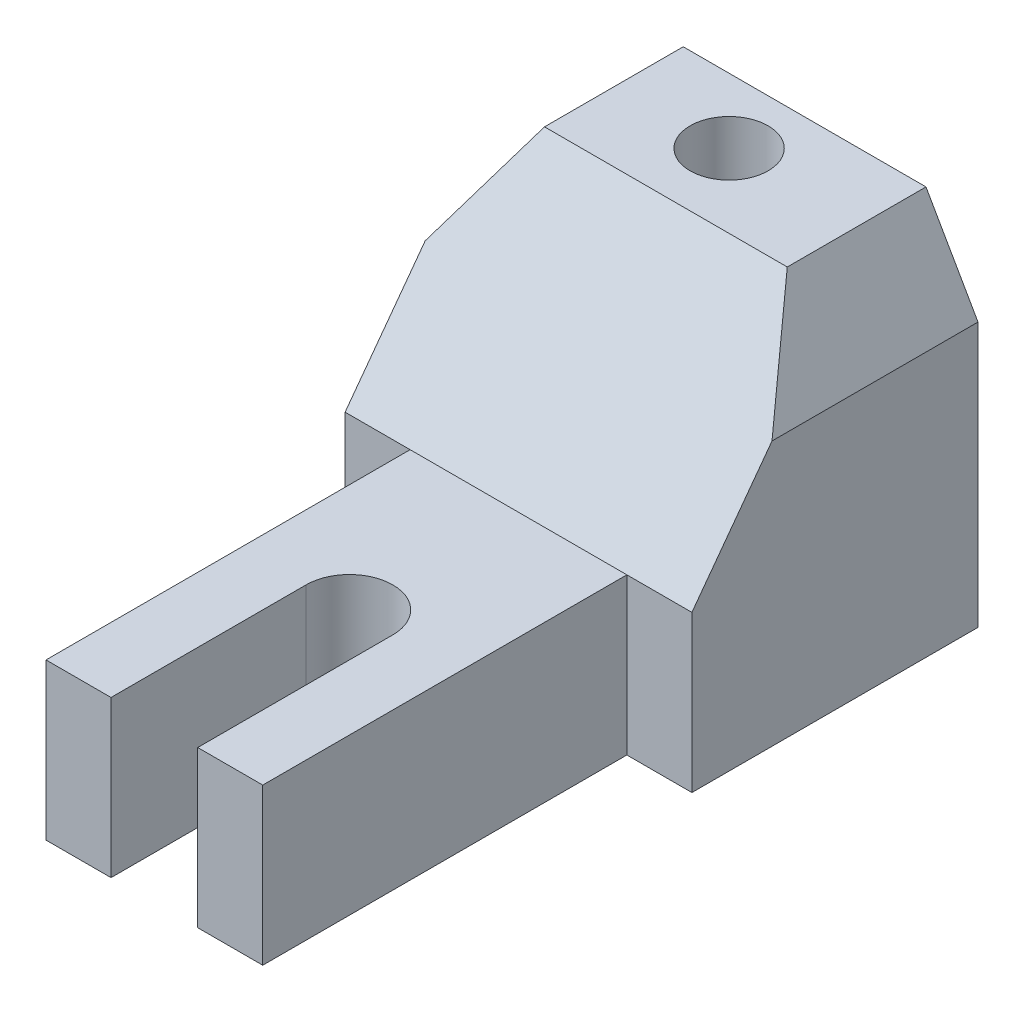
ISO-10303-21;
HEADER;
FILE_DESCRIPTION(('STEP AP214'),'2;1');
FILE_NAME('part.step','',(''),(''),'','','');
FILE_SCHEMA(('AUTOMOTIVE_DESIGN { 1 0 10303 214 1 1 1 1 }'));
ENDSEC;
DATA;
#1=APPLICATION_CONTEXT('core data for automotive mechanical design processes');
#2=APPLICATION_PROTOCOL_DEFINITION('international standard','automotive_design',2000,#1);
#3=PRODUCT_CONTEXT('',#1,'mechanical');
#4=PRODUCT('Part','Part','',(#3));
#5=PRODUCT_RELATED_PRODUCT_CATEGORY('part','',(#4));
#6=PRODUCT_DEFINITION_FORMATION('','',#4);
#7=PRODUCT_DEFINITION_CONTEXT('part definition',#1,'design');
#8=PRODUCT_DEFINITION('design','',#6,#7);
#9=PRODUCT_DEFINITION_SHAPE('','',#8);
#10=(LENGTH_UNIT() NAMED_UNIT(*) SI_UNIT(.MILLI.,.METRE.));
#11=(NAMED_UNIT(*) PLANE_ANGLE_UNIT() SI_UNIT($,.RADIAN.));
#12=(NAMED_UNIT(*) SI_UNIT($,.STERADIAN.) SOLID_ANGLE_UNIT());
#13=UNCERTAINTY_MEASURE_WITH_UNIT(LENGTH_MEASURE(1.E-05),#10,'distance_accuracy_value','');
#14=(GEOMETRIC_REPRESENTATION_CONTEXT(3) GLOBAL_UNCERTAINTY_ASSIGNED_CONTEXT((#13)) GLOBAL_UNIT_ASSIGNED_CONTEXT((#10,
#11,#12)) REPRESENTATION_CONTEXT('',''));
#15=CARTESIAN_POINT('',(0.,0.,0.));
#16=DIRECTION('',(0.,0.,1.));
#17=DIRECTION('',(1.,0.,0.));
#18=AXIS2_PLACEMENT_3D('',#15,#16,#17);
#19=CARTESIAN_POINT('',(-80.,0.,44.1718749999995));
#20=DIRECTION('',(0.,0.,1.));
#21=DIRECTION('',(1.,0.,0.));
#22=AXIS2_PLACEMENT_3D('',#19,#20,#21);
#23=PLANE('',#22);
#24=DIRECTION('',(1.,0.,0.));
#25=VECTOR('',#24,1.);
#26=CARTESIAN_POINT('',(-80.,36.,44.1718749999995));
#27=LINE('',#26,#25);
#28=CARTESIAN_POINT('',(-15.,36.,44.1718749999995));
#29=VERTEX_POINT('',#28);
#30=CARTESIAN_POINT('',(0.,36.,44.1718749999995));
#31=VERTEX_POINT('',#30);
#32=EDGE_CURVE('E257',#29,#31,#27,.T.);
#33=ORIENTED_EDGE('',*,*,#32,.F.);
#34=DIRECTION('',(0.,-1.,0.));
#35=VECTOR('',#34,1.);
#36=CARTESIAN_POINT('',(-15.,36.,44.1718749999995));
#37=LINE('',#36,#35);
#38=CARTESIAN_POINT('',(-15.,0.,44.1718749999995));
#39=VERTEX_POINT('',#38);
#40=EDGE_CURVE('E213',#29,#39,#37,.T.);
#41=ORIENTED_EDGE('',*,*,#40,.T.);
#42=DIRECTION('',(1.,0.,0.));
#43=VECTOR('',#42,1.);
#44=CARTESIAN_POINT('',(-80.,0.,44.1718749999995));
#45=LINE('',#44,#43);
#46=CARTESIAN_POINT('',(0.,0.,44.1718749999995));
#47=VERTEX_POINT('',#46);
#48=EDGE_CURVE('E253',#39,#47,#45,.T.);
#49=ORIENTED_EDGE('',*,*,#48,.T.);
#50=DIRECTION('',(0.,-1.,0.));
#51=VECTOR('',#50,1.);
#52=CARTESIAN_POINT('',(0.,0.,44.1718749999995));
#53=LINE('',#52,#51);
#54=EDGE_CURVE('E231',#31,#47,#53,.T.);
#55=ORIENTED_EDGE('',*,*,#54,.F.);
#56=EDGE_LOOP('',(#33,#41,#49,#55));
#57=FACE_BOUND('',#56,.T.);
#58=ADVANCED_FACE('F49',(#57),#23,.T.);
#59=CARTESIAN_POINT('',(-80.,0.,-21.8281250000005));
#60=DIRECTION('',(0.,-1.,0.));
#61=DIRECTION('',(0.,0.,-1.));
#62=AXIS2_PLACEMENT_3D('',#59,#60,#61);
#63=PLANE('',#62);
#64=DIRECTION('',(0.,0.,-1.));
#65=VECTOR('',#64,1.);
#66=CARTESIAN_POINT('',(0.,0.,-21.8281250000005));
#67=LINE('',#66,#65);
#68=CARTESIAN_POINT('',(0.,0.,-21.8281250000005));
#69=VERTEX_POINT('',#68);
#70=EDGE_CURVE('E224',#47,#69,#67,.T.);
#71=ORIENTED_EDGE('',*,*,#70,.F.);
#72=ORIENTED_EDGE('',*,*,#48,.F.);
#73=DIRECTION('',(0.,0.,1.));
#74=VECTOR('',#73,1.);
#75=CARTESIAN_POINT('',(-15.,0.,0.));
#76=LINE('',#75,#74);
#77=CARTESIAN_POINT('',(-15.,0.,128.171875));
#78=VERTEX_POINT('',#77);
#79=EDGE_CURVE('E65',#39,#78,#76,.T.);
#80=ORIENTED_EDGE('',*,*,#79,.T.);
#81=DIRECTION('',(1.,0.,0.));
#82=VECTOR('',#81,1.);
#83=CARTESIAN_POINT('',(0.,0.,128.171875));
#84=LINE('',#83,#82);
#85=CARTESIAN_POINT('',(-30.,0.,128.171875));
#86=VERTEX_POINT('',#85);
#87=EDGE_CURVE('E186',#86,#78,#84,.T.);
#88=ORIENTED_EDGE('',*,*,#87,.F.);
#89=DIRECTION('',(0.,0.,-1.));
#90=VECTOR('',#89,1.);
#91=CARTESIAN_POINT('',(-30.,0.,0.));
#92=LINE('',#91,#90);
#93=CARTESIAN_POINT('',(-30.,0.,83.1718749999995));
#94=VERTEX_POINT('',#93);
#95=EDGE_CURVE('E183',#86,#94,#92,.T.);
#96=ORIENTED_EDGE('',*,*,#95,.T.);
#97=CARTESIAN_POINT('',(-40.,0.,83.1718749999995));
#98=DIRECTION('',(0.,-1.,0.));
#99=DIRECTION('',(0.,0.,-1.));
#100=AXIS2_PLACEMENT_3D('',#97,#98,#99);
#101=CIRCLE('',#100,9.99999999999999);
#102=CARTESIAN_POINT('',(-50.,0.,83.1718749999995));
#103=VERTEX_POINT('',#102);
#104=EDGE_CURVE('E199',#103,#94,#101,.T.);
#105=ORIENTED_EDGE('',*,*,#104,.F.);
#106=DIRECTION('',(0.,0.,-1.));
#107=VECTOR('',#106,1.);
#108=CARTESIAN_POINT('',(-50.,0.,0.));
#109=LINE('',#108,#107);
#110=CARTESIAN_POINT('',(-50.,0.,128.171875));
#111=VERTEX_POINT('',#110);
#112=EDGE_CURVE('E173',#111,#103,#109,.T.);
#113=ORIENTED_EDGE('',*,*,#112,.F.);
#114=CARTESIAN_POINT('',(-65.,0.,128.171875));
#115=VERTEX_POINT('',#114);
#116=EDGE_CURVE('E202',#115,#111,#84,.T.);
#117=ORIENTED_EDGE('',*,*,#116,.F.);
#118=DIRECTION('',(0.,0.,1.));
#119=VECTOR('',#118,1.);
#120=CARTESIAN_POINT('',(-65.,0.,0.));
#121=LINE('',#120,#119);
#122=CARTESIAN_POINT('',(-65.,0.,44.1718749999995));
#123=VERTEX_POINT('',#122);
#124=EDGE_CURVE('E204',#123,#115,#121,.T.);
#125=ORIENTED_EDGE('',*,*,#124,.F.);
#126=CARTESIAN_POINT('',(-80.,0.,44.1718749999995));
#127=VERTEX_POINT('',#126);
#128=EDGE_CURVE('E249',#127,#123,#45,.T.);
#129=ORIENTED_EDGE('',*,*,#128,.F.);
#130=DIRECTION('',(0.,0.,-1.));
#131=VECTOR('',#130,1.);
#132=CARTESIAN_POINT('',(-80.,0.,-21.8281250000005));
#133=LINE('',#132,#131);
#134=CARTESIAN_POINT('',(-80.,0.,-21.8281250000005));
#135=VERTEX_POINT('',#134);
#136=EDGE_CURVE('E227',#127,#135,#133,.T.);
#137=ORIENTED_EDGE('',*,*,#136,.T.);
#138=DIRECTION('',(1.,0.,0.));
#139=VECTOR('',#138,1.);
#140=CARTESIAN_POINT('',(-80.,0.,-21.8281250000005));
#141=LINE('',#140,#139);
#142=EDGE_CURVE('E238',#135,#69,#141,.T.);
#143=ORIENTED_EDGE('',*,*,#142,.T.);
#144=EDGE_LOOP('',(#71,#72,#80,#88,#96,#105,#113,#117,#125,#129,#137,#143));
#145=FACE_BOUND('',#144,.T.);
#146=ADVANCED_FACE('F305',(#145),#63,.T.);
#147=DIRECTION('',(0.,-1.,0.));
#148=VECTOR('',#147,1.);
#149=CARTESIAN_POINT('',(-65.,36.,44.1718749999995));
#150=LINE('',#149,#148);
#151=CARTESIAN_POINT('',(-65.,36.,44.1718749999995));
#152=VERTEX_POINT('',#151);
#153=EDGE_CURVE('E215',#152,#123,#150,.T.);
#154=ORIENTED_EDGE('',*,*,#153,.F.);
#155=CARTESIAN_POINT('',(-80.,36.,44.1718749999995));
#156=VERTEX_POINT('',#155);
#157=EDGE_CURVE('E254',#156,#152,#27,.T.);
#158=ORIENTED_EDGE('',*,*,#157,.F.);
#159=DIRECTION('',(0.,-1.,0.));
#160=VECTOR('',#159,1.);
#161=CARTESIAN_POINT('',(-80.,0.,44.1718749999995));
#162=LINE('',#161,#160);
#163=EDGE_CURVE('E235',#156,#127,#162,.T.);
#164=ORIENTED_EDGE('',*,*,#163,.T.);
#165=ORIENTED_EDGE('',*,*,#128,.T.);
#166=EDGE_LOOP('',(#154,#158,#164,#165));
#167=FACE_BOUND('',#166,.T.);
#168=ADVANCED_FACE('F308',(#167),#23,.T.);
#169=CARTESIAN_POINT('',(-80.,36.,44.1718749999995));
#170=DIRECTION('',(0.,0.594391061083806,0.804176141466326));
#171=DIRECTION('',(0.,-0.804176141466326,0.594391061083806));
#172=AXIS2_PLACEMENT_3D('',#169,#170,#171);
#173=PLANE('',#172);
#174=DIRECTION('',(1.,0.,0.));
#175=VECTOR('',#174,1.);
#176=CARTESIAN_POINT('',(-80.,82.,10.1718749999996));
#177=LINE('',#176,#175);
#178=CARTESIAN_POINT('',(-68.,82.,10.1718749999996));
#179=VERTEX_POINT('',#178);
#180=CARTESIAN_POINT('',(-12.,82.,10.1718749999996));
#181=VERTEX_POINT('',#180);
#182=EDGE_CURVE('E258',#179,#181,#177,.T.);
#183=ORIENTED_EDGE('',*,*,#182,.F.);
#184=DIRECTION('',(0.417552512787548,0.730716897378209,-0.540095098062154));
#185=VECTOR('',#184,1.);
#186=CARTESIAN_POINT('',(-91.7949985580686,40.3587525233799,40.950188352284));
#187=LINE('',#186,#185);
#188=CARTESIAN_POINT('',(-80.,61.,25.6936141304343));
#189=VERTEX_POINT('',#188);
#190=EDGE_CURVE('E276',#179,#189,#187,.F.);
#191=ORIENTED_EDGE('',*,*,#190,.T.);
#192=DIRECTION('',(0.,-0.804176141466326,0.594391061083805));
#193=VECTOR('',#192,1.);
#194=CARTESIAN_POINT('',(-80.,36.,44.1718749999995));
#195=LINE('',#194,#193);
#196=EDGE_CURVE('E233',#189,#156,#195,.T.);
#197=ORIENTED_EDGE('',*,*,#196,.T.);
#198=ORIENTED_EDGE('',*,*,#157,.T.);
#199=DIRECTION('',(-1.,0.,0.));
#200=VECTOR('',#199,1.);
#201=CARTESIAN_POINT('',(0.,36.,44.1718749999995));
#202=LINE('',#201,#200);
#203=EDGE_CURVE('E193',#29,#152,#202,.T.);
#204=ORIENTED_EDGE('',*,*,#203,.F.);
#205=ORIENTED_EDGE('',*,*,#32,.T.);
#206=DIRECTION('',(0.,-0.804176141466326,0.594391061083805));
#207=VECTOR('',#206,1.);
#208=CARTESIAN_POINT('',(0.,36.,44.1718749999995));
#209=LINE('',#208,#207);
#210=CARTESIAN_POINT('',(0.,61.,25.6936141304343));
#211=VERTEX_POINT('',#210);
#212=EDGE_CURVE('E244',#211,#31,#209,.T.);
#213=ORIENTED_EDGE('',*,*,#212,.F.);
#214=DIRECTION('',(-0.417552512787548,0.730716897378209,-0.540095098062154));
#215=VECTOR('',#214,1.);
#216=CARTESIAN_POINT('',(-2.15300951674699,64.7677666543072,22.9087431250768));
#217=LINE('',#216,#215);
#218=EDGE_CURVE('E265',#211,#181,#217,.T.);
#219=ORIENTED_EDGE('',*,*,#218,.T.);
#220=EDGE_LOOP('',(#183,#191,#197,#198,#204,#205,#213,#219));
#221=FACE_BOUND('',#220,.T.);
#222=ADVANCED_FACE('F279',(#221),#173,.T.);
#223=CARTESIAN_POINT('',(-80.,82.,10.1718749999996));
#224=DIRECTION('',(0.,1.,0.));
#225=DIRECTION('',(0.,0.,1.));
#226=AXIS2_PLACEMENT_3D('',#223,#224,#225);
#227=PLANE('',#226);
#228=CARTESIAN_POINT('',(-42.4156231358666,82.,-6.82812500000044));
#229=DIRECTION('',(0.,1.,0.));
#230=DIRECTION('',(0.,0.,1.));
#231=AXIS2_PLACEMENT_3D('',#228,#229,#230);
#232=CIRCLE('',#231,9.);
#233=CARTESIAN_POINT('',(-42.4156231358666,82.,2.17187499999956));
#234=VERTEX_POINT('',#233);
#235=EDGE_CURVE('E208',#234,#234,#232,.T.);
#236=ORIENTED_EDGE('',*,*,#235,.F.);
#237=EDGE_LOOP('',(#236));
#238=FACE_BOUND('',#237,.T.);
#239=DIRECTION('',(1.,0.,0.));
#240=VECTOR('',#239,1.);
#241=CARTESIAN_POINT('',(-80.,82.,-21.8281250000004));
#242=LINE('',#241,#240);
#243=CARTESIAN_POINT('',(-68.,82.,-21.8281250000004));
#244=VERTEX_POINT('',#243);
#245=CARTESIAN_POINT('',(-12.,82.,-21.8281250000004));
#246=VERTEX_POINT('',#245);
#247=EDGE_CURVE('E260',#244,#246,#242,.T.);
#248=ORIENTED_EDGE('',*,*,#247,.F.);
#249=DIRECTION('',(0.,0.,1.));
#250=VECTOR('',#249,1.);
#251=CARTESIAN_POINT('',(-68.,82.,10.1718749999996));
#252=LINE('',#251,#250);
#253=EDGE_CURVE('E273',#244,#179,#252,.T.);
#254=ORIENTED_EDGE('',*,*,#253,.T.);
#255=ORIENTED_EDGE('',*,*,#182,.T.);
#256=DIRECTION('',(0.,0.,-1.));
#257=VECTOR('',#256,1.);
#258=CARTESIAN_POINT('',(-12.,82.,-21.8281250000004));
#259=LINE('',#258,#257);
#260=EDGE_CURVE('E268',#181,#246,#259,.T.);
#261=ORIENTED_EDGE('',*,*,#260,.T.);
#262=EDGE_LOOP('',(#248,#254,#255,#261));
#263=FACE_BOUND('',#262,.T.);
#264=ADVANCED_FACE('F291',(#238,#263),#227,.T.);
#265=CARTESIAN_POINT('',(-80.,82.,-21.8281250000004));
#266=DIRECTION('',(0.,0.,-1.));
#267=DIRECTION('',(0.,1.,0.));
#268=AXIS2_PLACEMENT_3D('',#265,#266,#267);
#269=PLANE('',#268);
#270=DIRECTION('',(0.,1.,0.));
#271=VECTOR('',#270,1.);
#272=CARTESIAN_POINT('',(-80.,82.,-21.8281250000004));
#273=LINE('',#272,#271);
#274=CARTESIAN_POINT('',(-80.,61.,-21.8281250000004));
#275=VERTEX_POINT('',#274);
#276=EDGE_CURVE('E230',#135,#275,#273,.T.);
#277=ORIENTED_EDGE('',*,*,#276,.T.);
#278=DIRECTION('',(-0.496138938356834,-0.868243142124459,0.));
#279=VECTOR('',#278,1.);
#280=CARTESIAN_POINT('',(-70.9538461538462,76.8307692307692,-21.8281250000004));
#281=LINE('',#280,#279);
#282=EDGE_CURVE('E13',#275,#244,#281,.F.);
#283=ORIENTED_EDGE('',*,*,#282,.T.);
#284=ORIENTED_EDGE('',*,*,#247,.T.);
#285=DIRECTION('',(0.496138938356834,-0.868243142124459,0.));
#286=VECTOR('',#285,1.);
#287=CARTESIAN_POINT('',(-28.7384615384615,111.292307692308,-21.8281250000004));
#288=LINE('',#287,#286);
#289=CARTESIAN_POINT('',(0.,61.,-21.8281250000004));
#290=VERTEX_POINT('',#289);
#291=EDGE_CURVE('E271',#246,#290,#288,.T.);
#292=ORIENTED_EDGE('',*,*,#291,.T.);
#293=DIRECTION('',(0.,1.,0.));
#294=VECTOR('',#293,1.);
#295=CARTESIAN_POINT('',(0.,82.,-21.8281250000004));
#296=LINE('',#295,#294);
#297=EDGE_CURVE('E241',#69,#290,#296,.T.);
#298=ORIENTED_EDGE('',*,*,#297,.F.);
#299=ORIENTED_EDGE('',*,*,#142,.F.);
#300=EDGE_LOOP('',(#277,#283,#284,#292,#298,#299));
#301=FACE_BOUND('',#300,.T.);
#302=ADVANCED_FACE('F289',(#301),#269,.T.);
#303=CARTESIAN_POINT('',(-80.,0.,0.));
#304=DIRECTION('',(-1.,0.,0.));
#305=DIRECTION('',(0.,0.,1.));
#306=AXIS2_PLACEMENT_3D('',#303,#304,#305);
#307=PLANE('',#306);
#308=ORIENTED_EDGE('',*,*,#196,.F.);
#309=DIRECTION('',(0.,0.,-1.));
#310=VECTOR('',#309,1.);
#311=CARTESIAN_POINT('',(-80.,61.,0.));
#312=LINE('',#311,#310);
#313=EDGE_CURVE('E58',#189,#275,#312,.T.);
#314=ORIENTED_EDGE('',*,*,#313,.T.);
#315=ORIENTED_EDGE('',*,*,#276,.F.);
#316=ORIENTED_EDGE('',*,*,#136,.F.);
#317=ORIENTED_EDGE('',*,*,#163,.F.);
#318=EDGE_LOOP('',(#308,#314,#315,#316,#317));
#319=FACE_BOUND('',#318,.T.);
#320=ADVANCED_FACE('F284',(#319),#307,.T.);
#321=CARTESIAN_POINT('',(0.,0.,0.));
#322=DIRECTION('',(-1.,0.,0.));
#323=DIRECTION('',(0.,0.,1.));
#324=AXIS2_PLACEMENT_3D('',#321,#322,#323);
#325=PLANE('',#324);
#326=ORIENTED_EDGE('',*,*,#297,.T.);
#327=DIRECTION('',(0.,0.,1.));
#328=VECTOR('',#327,1.);
#329=CARTESIAN_POINT('',(0.,61.,10.1718749999996));
#330=LINE('',#329,#328);
#331=EDGE_CURVE('E252',#290,#211,#330,.T.);
#332=ORIENTED_EDGE('',*,*,#331,.T.);
#333=ORIENTED_EDGE('',*,*,#212,.T.);
#334=ORIENTED_EDGE('',*,*,#54,.T.);
#335=ORIENTED_EDGE('',*,*,#70,.T.);
#336=EDGE_LOOP('',(#326,#332,#333,#334,#335));
#337=FACE_BOUND('',#336,.T.);
#338=ADVANCED_FACE('F299',(#337),#325,.F.);
#339=CARTESIAN_POINT('',(0.,61.,0.));
#340=DIRECTION('',(0.868243142124459,0.496138938356834,0.));
#341=DIRECTION('',(0.,0.,-1.));
#342=AXIS2_PLACEMENT_3D('',#339,#340,#341);
#343=PLANE('',#342);
#344=ORIENTED_EDGE('',*,*,#291,.F.);
#345=ORIENTED_EDGE('',*,*,#260,.F.);
#346=ORIENTED_EDGE('',*,*,#218,.F.);
#347=ORIENTED_EDGE('',*,*,#331,.F.);
#348=EDGE_LOOP('',(#344,#345,#346,#347));
#349=FACE_BOUND('',#348,.T.);
#350=ADVANCED_FACE('F296',(#349),#343,.T.);
#351=CARTESIAN_POINT('',(-68.,82.,10.1718749999996));
#352=DIRECTION('',(0.868243142124459,-0.496138938356834,0.));
#353=DIRECTION('',(0.,0.,1.));
#354=AXIS2_PLACEMENT_3D('',#351,#352,#353);
#355=PLANE('',#354);
#356=ORIENTED_EDGE('',*,*,#282,.F.);
#357=ORIENTED_EDGE('',*,*,#313,.F.);
#358=ORIENTED_EDGE('',*,*,#190,.F.);
#359=ORIENTED_EDGE('',*,*,#253,.F.);
#360=EDGE_LOOP('',(#356,#357,#358,#359));
#361=FACE_BOUND('',#360,.T.);
#362=ADVANCED_FACE('F52',(#361),#355,.F.);
#363=CARTESIAN_POINT('',(-42.4156231358666,2.,-6.82812500000044));
#364=DIRECTION('',(0.,1.,0.));
#365=DIRECTION('',(0.,0.,1.));
#366=AXIS2_PLACEMENT_3D('',#363,#364,#365);
#367=CYLINDRICAL_SURFACE('',#366,9.);
#368=CARTESIAN_POINT('',(-42.4156231358666,2.,-6.82812500000044));
#369=DIRECTION('',(0.,1.,0.));
#370=DIRECTION('',(0.,0.,1.));
#371=AXIS2_PLACEMENT_3D('',#368,#369,#370);
#372=CIRCLE('',#371,9.);
#373=CARTESIAN_POINT('',(-42.4156231358666,2.,2.17187499999956));
#374=VERTEX_POINT('',#373);
#375=EDGE_CURVE('E221',#374,#374,#372,.T.);
#376=ORIENTED_EDGE('',*,*,#375,.F.);
#377=EDGE_LOOP('',(#376));
#378=FACE_BOUND('',#377,.T.);
#379=ORIENTED_EDGE('',*,*,#235,.T.);
#380=EDGE_LOOP('',(#379));
#381=FACE_BOUND('',#380,.T.);
#382=ADVANCED_FACE('F358',(#378,#381),#367,.F.);
#383=CARTESIAN_POINT('',(-42.4156231358666,2.,-6.82812500000044));
#384=DIRECTION('',(0.,1.,0.));
#385=DIRECTION('',(0.,0.,1.));
#386=AXIS2_PLACEMENT_3D('',#383,#384,#385);
#387=PLANE('',#386);
#388=ORIENTED_EDGE('',*,*,#375,.T.);
#389=EDGE_LOOP('',(#388));
#390=FACE_BOUND('',#389,.T.);
#391=ADVANCED_FACE('F366',(#390),#387,.T.);
#392=CARTESIAN_POINT('',(-40.,36.,83.1718749999995));
#393=DIRECTION('',(0.,-1.,0.));
#394=DIRECTION('',(0.,0.,-1.));
#395=AXIS2_PLACEMENT_3D('',#392,#393,#394);
#396=CYLINDRICAL_SURFACE('',#395,9.99999999999999);
#397=ORIENTED_EDGE('',*,*,#104,.T.);
#398=DIRECTION('',(0.,-1.,0.));
#399=VECTOR('',#398,1.);
#400=CARTESIAN_POINT('',(-30.,36.,83.1718749999995));
#401=LINE('',#400,#399);
#402=CARTESIAN_POINT('',(-30.,36.,83.1718749999995));
#403=VERTEX_POINT('',#402);
#404=EDGE_CURVE('E181',#403,#94,#401,.T.);
#405=ORIENTED_EDGE('',*,*,#404,.F.);
#406=CARTESIAN_POINT('',(-40.,36.,83.1718749999995));
#407=DIRECTION('',(0.,-1.,0.));
#408=DIRECTION('',(0.,0.,-1.));
#409=AXIS2_PLACEMENT_3D('',#406,#407,#408);
#410=CIRCLE('',#409,9.99999999999999);
#411=CARTESIAN_POINT('',(-50.,36.,83.1718749999995));
#412=VERTEX_POINT('',#411);
#413=EDGE_CURVE('E161',#412,#403,#410,.T.);
#414=ORIENTED_EDGE('',*,*,#413,.F.);
#415=DIRECTION('',(0.,-1.,0.));
#416=VECTOR('',#415,1.);
#417=CARTESIAN_POINT('',(-50.,36.,83.1718749999995));
#418=LINE('',#417,#416);
#419=EDGE_CURVE('E170',#412,#103,#418,.T.);
#420=ORIENTED_EDGE('',*,*,#419,.T.);
#421=EDGE_LOOP('',(#397,#405,#414,#420));
#422=FACE_BOUND('',#421,.T.);
#423=ADVANCED_FACE('F180',(#422),#396,.F.);
#424=CARTESIAN_POINT('',(-30.,36.,0.));
#425=DIRECTION('',(-1.,0.,0.));
#426=DIRECTION('',(0.,0.,1.));
#427=AXIS2_PLACEMENT_3D('',#424,#425,#426);
#428=PLANE('',#427);
#429=ORIENTED_EDGE('',*,*,#95,.F.);
#430=DIRECTION('',(0.,-1.,0.));
#431=VECTOR('',#430,1.);
#432=CARTESIAN_POINT('',(-30.,36.,128.171875));
#433=LINE('',#432,#431);
#434=CARTESIAN_POINT('',(-30.,36.,128.171875));
#435=VERTEX_POINT('',#434);
#436=EDGE_CURVE('E209',#435,#86,#433,.T.);
#437=ORIENTED_EDGE('',*,*,#436,.F.);
#438=DIRECTION('',(0.,0.,-1.));
#439=VECTOR('',#438,1.);
#440=CARTESIAN_POINT('',(-30.,36.,0.));
#441=LINE('',#440,#439);
#442=EDGE_CURVE('E178',#435,#403,#441,.T.);
#443=ORIENTED_EDGE('',*,*,#442,.T.);
#444=ORIENTED_EDGE('',*,*,#404,.T.);
#445=EDGE_LOOP('',(#429,#437,#443,#444));
#446=FACE_BOUND('',#445,.T.);
#447=ADVANCED_FACE('F324',(#446),#428,.T.);
#448=CARTESIAN_POINT('',(0.,36.,128.171875));
#449=DIRECTION('',(0.,0.,-1.));
#450=DIRECTION('',(-1.,0.,0.));
#451=AXIS2_PLACEMENT_3D('',#448,#449,#450);
#452=PLANE('',#451);
#453=ORIENTED_EDGE('',*,*,#87,.T.);
#454=DIRECTION('',(0.,-1.,0.));
#455=VECTOR('',#454,1.);
#456=CARTESIAN_POINT('',(-15.,36.,128.171875));
#457=LINE('',#456,#455);
#458=CARTESIAN_POINT('',(-15.,36.,128.171875));
#459=VERTEX_POINT('',#458);
#460=EDGE_CURVE('E211',#459,#78,#457,.T.);
#461=ORIENTED_EDGE('',*,*,#460,.F.);
#462=DIRECTION('',(1.,0.,0.));
#463=VECTOR('',#462,1.);
#464=CARTESIAN_POINT('',(0.,36.,128.171875));
#465=LINE('',#464,#463);
#466=EDGE_CURVE('E191',#435,#459,#465,.T.);
#467=ORIENTED_EDGE('',*,*,#466,.F.);
#468=ORIENTED_EDGE('',*,*,#436,.T.);
#469=EDGE_LOOP('',(#453,#461,#467,#468));
#470=FACE_BOUND('',#469,.T.);
#471=ADVANCED_FACE('F328',(#470),#452,.F.);
#472=CARTESIAN_POINT('',(-15.,36.,0.));
#473=DIRECTION('',(1.,0.,0.));
#474=DIRECTION('',(0.,0.,-1.));
#475=AXIS2_PLACEMENT_3D('',#472,#473,#474);
#476=PLANE('',#475);
#477=ORIENTED_EDGE('',*,*,#79,.F.);
#478=ORIENTED_EDGE('',*,*,#40,.F.);
#479=DIRECTION('',(0.,0.,1.));
#480=VECTOR('',#479,1.);
#481=CARTESIAN_POINT('',(-15.,36.,0.));
#482=LINE('',#481,#480);
#483=EDGE_CURVE('E195',#29,#459,#482,.T.);
#484=ORIENTED_EDGE('',*,*,#483,.T.);
#485=ORIENTED_EDGE('',*,*,#460,.T.);
#486=EDGE_LOOP('',(#477,#478,#484,#485));
#487=FACE_BOUND('',#486,.T.);
#488=ADVANCED_FACE('F329',(#487),#476,.T.);
#489=CARTESIAN_POINT('',(-65.,36.,0.));
#490=DIRECTION('',(1.,0.,0.));
#491=DIRECTION('',(0.,0.,-1.));
#492=AXIS2_PLACEMENT_3D('',#489,#490,#491);
#493=PLANE('',#492);
#494=ORIENTED_EDGE('',*,*,#124,.T.);
#495=DIRECTION('',(0.,-1.,0.));
#496=VECTOR('',#495,1.);
#497=CARTESIAN_POINT('',(-65.,36.,128.171875));
#498=LINE('',#497,#496);
#499=CARTESIAN_POINT('',(-65.,36.,128.171875));
#500=VERTEX_POINT('',#499);
#501=EDGE_CURVE('E217',#500,#115,#498,.T.);
#502=ORIENTED_EDGE('',*,*,#501,.F.);
#503=DIRECTION('',(0.,0.,1.));
#504=VECTOR('',#503,1.);
#505=CARTESIAN_POINT('',(-65.,36.,0.));
#506=LINE('',#505,#504);
#507=EDGE_CURVE('E190',#152,#500,#506,.T.);
#508=ORIENTED_EDGE('',*,*,#507,.F.);
#509=ORIENTED_EDGE('',*,*,#153,.T.);
#510=EDGE_LOOP('',(#494,#502,#508,#509));
#511=FACE_BOUND('',#510,.T.);
#512=ADVANCED_FACE('F315',(#511),#493,.F.);
#513=ORIENTED_EDGE('',*,*,#116,.T.);
#514=DIRECTION('',(0.,-1.,0.));
#515=VECTOR('',#514,1.);
#516=CARTESIAN_POINT('',(-50.,36.,128.171875));
#517=LINE('',#516,#515);
#518=CARTESIAN_POINT('',(-50.,36.,128.171875));
#519=VERTEX_POINT('',#518);
#520=EDGE_CURVE('E177',#519,#111,#517,.T.);
#521=ORIENTED_EDGE('',*,*,#520,.F.);
#522=EDGE_CURVE('E164',#500,#519,#465,.T.);
#523=ORIENTED_EDGE('',*,*,#522,.F.);
#524=ORIENTED_EDGE('',*,*,#501,.T.);
#525=EDGE_LOOP('',(#513,#521,#523,#524));
#526=FACE_BOUND('',#525,.T.);
#527=ADVANCED_FACE('F319',(#526),#452,.F.);
#528=CARTESIAN_POINT('',(-50.,36.,0.));
#529=DIRECTION('',(-1.,0.,0.));
#530=DIRECTION('',(0.,0.,1.));
#531=AXIS2_PLACEMENT_3D('',#528,#529,#530);
#532=PLANE('',#531);
#533=ORIENTED_EDGE('',*,*,#112,.T.);
#534=ORIENTED_EDGE('',*,*,#419,.F.);
#535=DIRECTION('',(0.,0.,-1.));
#536=VECTOR('',#535,1.);
#537=CARTESIAN_POINT('',(-50.,36.,0.));
#538=LINE('',#537,#536);
#539=EDGE_CURVE('E156',#519,#412,#538,.T.);
#540=ORIENTED_EDGE('',*,*,#539,.F.);
#541=ORIENTED_EDGE('',*,*,#520,.T.);
#542=EDGE_LOOP('',(#533,#534,#540,#541));
#543=FACE_BOUND('',#542,.T.);
#544=ADVANCED_FACE('F171',(#543),#532,.F.);
#545=CARTESIAN_POINT('',(0.,36.,0.));
#546=DIRECTION('',(0.,-1.,0.));
#547=DIRECTION('',(0.,0.,-1.));
#548=AXIS2_PLACEMENT_3D('',#545,#546,#547);
#549=PLANE('',#548);
#550=ORIENTED_EDGE('',*,*,#413,.T.);
#551=ORIENTED_EDGE('',*,*,#442,.F.);
#552=ORIENTED_EDGE('',*,*,#466,.T.);
#553=ORIENTED_EDGE('',*,*,#483,.F.);
#554=ORIENTED_EDGE('',*,*,#203,.T.);
#555=ORIENTED_EDGE('',*,*,#507,.T.);
#556=ORIENTED_EDGE('',*,*,#522,.T.);
#557=ORIENTED_EDGE('',*,*,#539,.T.);
#558=EDGE_LOOP('',(#550,#551,#552,#553,#554,#555,#556,#557));
#559=FACE_BOUND('',#558,.T.);
#560=ADVANCED_FACE('F158',(#559),#549,.F.);
#561=CLOSED_SHELL('',(#58,#146,#168,#222,#264,#302,#320,#338,#350,#362,#382,#391,#423,#447,#471,
#488,#512,#527,#544,#560));
#562=MANIFOLD_SOLID_BREP('B2',#561);
#563=ADVANCED_BREP_SHAPE_REPRESENTATION('',(#18,#562),#14);
#564=SHAPE_DEFINITION_REPRESENTATION(#9,#563);
ENDSEC;
END-ISO-10303-21;
